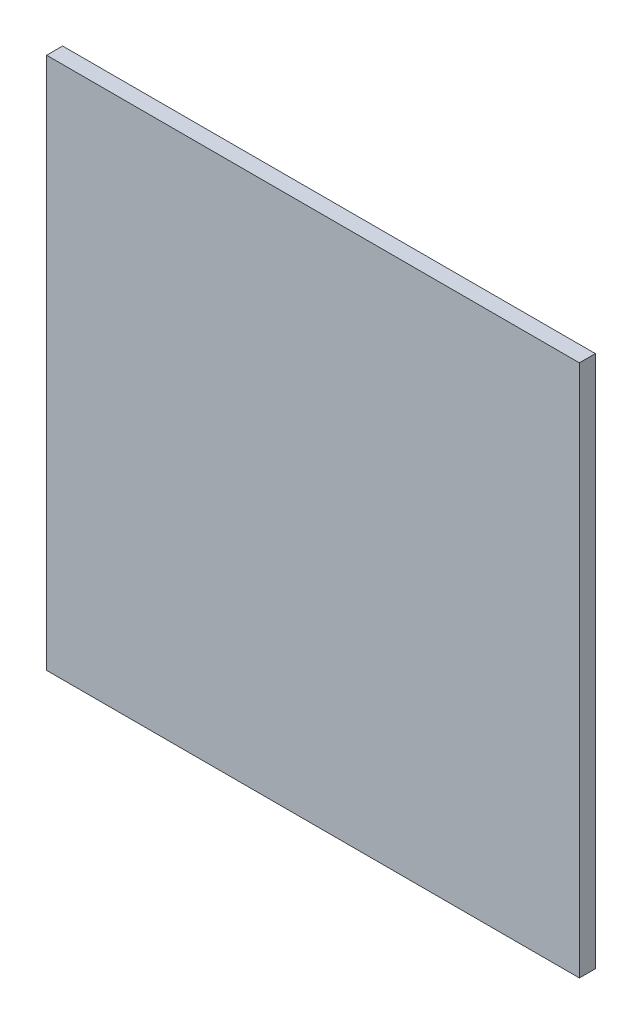
ISO-10303-21;
HEADER;
FILE_DESCRIPTION(('STEP AP214'),'2;1');
FILE_NAME('part.step','',(''),(''),'','','');
FILE_SCHEMA(('AUTOMOTIVE_DESIGN { 1 0 10303 214 1 1 1 1 }'));
ENDSEC;
DATA;
#1=APPLICATION_CONTEXT('core data for automotive mechanical design processes');
#2=APPLICATION_PROTOCOL_DEFINITION('international standard','automotive_design',2000,#1);
#3=PRODUCT_CONTEXT('',#1,'mechanical');
#4=PRODUCT('Part','Part','',(#3));
#5=PRODUCT_RELATED_PRODUCT_CATEGORY('part','',(#4));
#6=PRODUCT_DEFINITION_FORMATION('','',#4);
#7=PRODUCT_DEFINITION_CONTEXT('part definition',#1,'design');
#8=PRODUCT_DEFINITION('design','',#6,#7);
#9=PRODUCT_DEFINITION_SHAPE('','',#8);
#10=(LENGTH_UNIT() NAMED_UNIT(*) SI_UNIT(.MILLI.,.METRE.));
#11=(NAMED_UNIT(*) PLANE_ANGLE_UNIT() SI_UNIT($,.RADIAN.));
#12=(NAMED_UNIT(*) SI_UNIT($,.STERADIAN.) SOLID_ANGLE_UNIT());
#13=UNCERTAINTY_MEASURE_WITH_UNIT(LENGTH_MEASURE(1.E-05),#10,'distance_accuracy_value','');
#14=(GEOMETRIC_REPRESENTATION_CONTEXT(3) GLOBAL_UNCERTAINTY_ASSIGNED_CONTEXT((#13)) GLOBAL_UNIT_ASSIGNED_CONTEXT((#10,
#11,#12)) REPRESENTATION_CONTEXT('',''));
#15=CARTESIAN_POINT('',(0.,0.,0.));
#16=DIRECTION('',(0.,0.,1.));
#17=DIRECTION('',(1.,0.,0.));
#18=AXIS2_PLACEMENT_3D('',#15,#16,#17);
#19=CARTESIAN_POINT('',(250.,-250.,15.));
#20=DIRECTION('',(-1.,0.,0.));
#21=DIRECTION('',(0.,0.,1.));
#22=AXIS2_PLACEMENT_3D('',#19,#20,#21);
#23=PLANE('',#22);
#24=DIRECTION('',(0.,1.,0.));
#25=VECTOR('',#24,1.);
#26=CARTESIAN_POINT('',(250.,-250.,0.));
#27=LINE('',#26,#25);
#28=CARTESIAN_POINT('',(250.,-250.,0.));
#29=VERTEX_POINT('',#28);
#30=CARTESIAN_POINT('',(250.,250.,0.));
#31=VERTEX_POINT('',#30);
#32=EDGE_CURVE('E102',#29,#31,#27,.T.);
#33=ORIENTED_EDGE('',*,*,#32,.T.);
#34=DIRECTION('',(0.,0.,-1.));
#35=VECTOR('',#34,1.);
#36=CARTESIAN_POINT('',(250.,250.,15.));
#37=LINE('',#36,#35);
#38=CARTESIAN_POINT('',(250.,250.,15.));
#39=VERTEX_POINT('',#38);
#40=EDGE_CURVE('E11',#39,#31,#37,.T.);
#41=ORIENTED_EDGE('',*,*,#40,.F.);
#42=DIRECTION('',(0.,1.,0.));
#43=VECTOR('',#42,1.);
#44=CARTESIAN_POINT('',(250.,-250.,15.));
#45=LINE('',#44,#43);
#46=CARTESIAN_POINT('',(250.,-250.,15.));
#47=VERTEX_POINT('',#46);
#48=EDGE_CURVE('E90',#47,#39,#45,.T.);
#49=ORIENTED_EDGE('',*,*,#48,.F.);
#50=DIRECTION('',(0.,0.,-1.));
#51=VECTOR('',#50,1.);
#52=CARTESIAN_POINT('',(250.,-250.,15.));
#53=LINE('',#52,#51);
#54=EDGE_CURVE('E98',#47,#29,#53,.T.);
#55=ORIENTED_EDGE('',*,*,#54,.T.);
#56=EDGE_LOOP('',(#33,#41,#49,#55));
#57=FACE_BOUND('',#56,.T.);
#58=ADVANCED_FACE('F39',(#57),#23,.F.);
#59=CARTESIAN_POINT('',(-250.,250.,15.));
#60=DIRECTION('',(0.,-1.,0.));
#61=DIRECTION('',(0.,0.,-1.));
#62=AXIS2_PLACEMENT_3D('',#59,#60,#61);
#63=PLANE('',#62);
#64=DIRECTION('',(-1.,0.,0.));
#65=VECTOR('',#64,1.);
#66=CARTESIAN_POINT('',(-250.,250.,0.));
#67=LINE('',#66,#65);
#68=CARTESIAN_POINT('',(-250.,250.,0.));
#69=VERTEX_POINT('',#68);
#70=EDGE_CURVE('E94',#31,#69,#67,.T.);
#71=ORIENTED_EDGE('',*,*,#70,.T.);
#72=DIRECTION('',(0.,0.,-1.));
#73=VECTOR('',#72,1.);
#74=CARTESIAN_POINT('',(-250.,250.,15.));
#75=LINE('',#74,#73);
#76=CARTESIAN_POINT('',(-250.,250.,15.));
#77=VERTEX_POINT('',#76);
#78=EDGE_CURVE('E47',#77,#69,#75,.T.);
#79=ORIENTED_EDGE('',*,*,#78,.F.);
#80=DIRECTION('',(-1.,0.,0.));
#81=VECTOR('',#80,1.);
#82=CARTESIAN_POINT('',(-250.,250.,15.));
#83=LINE('',#82,#81);
#84=EDGE_CURVE('E85',#39,#77,#83,.T.);
#85=ORIENTED_EDGE('',*,*,#84,.F.);
#86=ORIENTED_EDGE('',*,*,#40,.T.);
#87=EDGE_LOOP('',(#71,#79,#85,#86));
#88=FACE_BOUND('',#87,.T.);
#89=ADVANCED_FACE('F93',(#88),#63,.F.);
#90=CARTESIAN_POINT('',(-250.,-250.,15.));
#91=DIRECTION('',(1.,0.,0.));
#92=DIRECTION('',(0.,0.,-1.));
#93=AXIS2_PLACEMENT_3D('',#90,#91,#92);
#94=PLANE('',#93);
#95=DIRECTION('',(0.,-1.,0.));
#96=VECTOR('',#95,1.);
#97=CARTESIAN_POINT('',(-250.,-250.,0.));
#98=LINE('',#97,#96);
#99=CARTESIAN_POINT('',(-250.,-250.,0.));
#100=VERTEX_POINT('',#99);
#101=EDGE_CURVE('E72',#69,#100,#98,.T.);
#102=ORIENTED_EDGE('',*,*,#101,.T.);
#103=DIRECTION('',(0.,0.,-1.));
#104=VECTOR('',#103,1.);
#105=CARTESIAN_POINT('',(-250.,-250.,15.));
#106=LINE('',#105,#104);
#107=CARTESIAN_POINT('',(-250.,-250.,15.));
#108=VERTEX_POINT('',#107);
#109=EDGE_CURVE('E95',#108,#100,#106,.T.);
#110=ORIENTED_EDGE('',*,*,#109,.F.);
#111=DIRECTION('',(0.,-1.,0.));
#112=VECTOR('',#111,1.);
#113=CARTESIAN_POINT('',(-250.,-250.,15.));
#114=LINE('',#113,#112);
#115=EDGE_CURVE('E88',#77,#108,#114,.T.);
#116=ORIENTED_EDGE('',*,*,#115,.F.);
#117=ORIENTED_EDGE('',*,*,#78,.T.);
#118=EDGE_LOOP('',(#102,#110,#116,#117));
#119=FACE_BOUND('',#118,.T.);
#120=ADVANCED_FACE('F96',(#119),#94,.F.);
#121=CARTESIAN_POINT('',(-250.,-250.,15.));
#122=DIRECTION('',(0.,1.,0.));
#123=DIRECTION('',(0.,0.,1.));
#124=AXIS2_PLACEMENT_3D('',#121,#122,#123);
#125=PLANE('',#124);
#126=DIRECTION('',(1.,0.,0.));
#127=VECTOR('',#126,1.);
#128=CARTESIAN_POINT('',(-250.,-250.,0.));
#129=LINE('',#128,#127);
#130=EDGE_CURVE('E78',#100,#29,#129,.T.);
#131=ORIENTED_EDGE('',*,*,#130,.T.);
#132=ORIENTED_EDGE('',*,*,#54,.F.);
#133=DIRECTION('',(1.,0.,0.));
#134=VECTOR('',#133,1.);
#135=CARTESIAN_POINT('',(-250.,-250.,15.));
#136=LINE('',#135,#134);
#137=EDGE_CURVE('E55',#108,#47,#136,.T.);
#138=ORIENTED_EDGE('',*,*,#137,.F.);
#139=ORIENTED_EDGE('',*,*,#109,.T.);
#140=EDGE_LOOP('',(#131,#132,#138,#139));
#141=FACE_BOUND('',#140,.T.);
#142=ADVANCED_FACE('F109',(#141),#125,.F.);
#143=CARTESIAN_POINT('',(0.,0.,15.));
#144=DIRECTION('',(0.,0.,-1.));
#145=DIRECTION('',(-1.,0.,0.));
#146=AXIS2_PLACEMENT_3D('',#143,#144,#145);
#147=PLANE('',#146);
#148=ORIENTED_EDGE('',*,*,#48,.T.);
#149=ORIENTED_EDGE('',*,*,#84,.T.);
#150=ORIENTED_EDGE('',*,*,#115,.T.);
#151=ORIENTED_EDGE('',*,*,#137,.T.);
#152=EDGE_LOOP('',(#148,#149,#150,#151));
#153=FACE_BOUND('',#152,.T.);
#154=ADVANCED_FACE('F86',(#153),#147,.F.);
#155=CARTESIAN_POINT('',(0.,0.,0.));
#156=DIRECTION('',(0.,0.,-1.));
#157=DIRECTION('',(-1.,0.,0.));
#158=AXIS2_PLACEMENT_3D('',#155,#156,#157);
#159=PLANE('',#158);
#160=ORIENTED_EDGE('',*,*,#32,.F.);
#161=ORIENTED_EDGE('',*,*,#130,.F.);
#162=ORIENTED_EDGE('',*,*,#101,.F.);
#163=ORIENTED_EDGE('',*,*,#70,.F.);
#164=EDGE_LOOP('',(#160,#161,#162,#163));
#165=FACE_BOUND('',#164,.T.);
#166=ADVANCED_FACE('F112',(#165),#159,.T.);
#167=CLOSED_SHELL('',(#58,#89,#120,#142,#154,#166));
#168=MANIFOLD_SOLID_BREP('B2',#167);
#169=ADVANCED_BREP_SHAPE_REPRESENTATION('',(#18,#168),#14);
#170=SHAPE_DEFINITION_REPRESENTATION(#9,#169);
ENDSEC;
END-ISO-10303-21;
